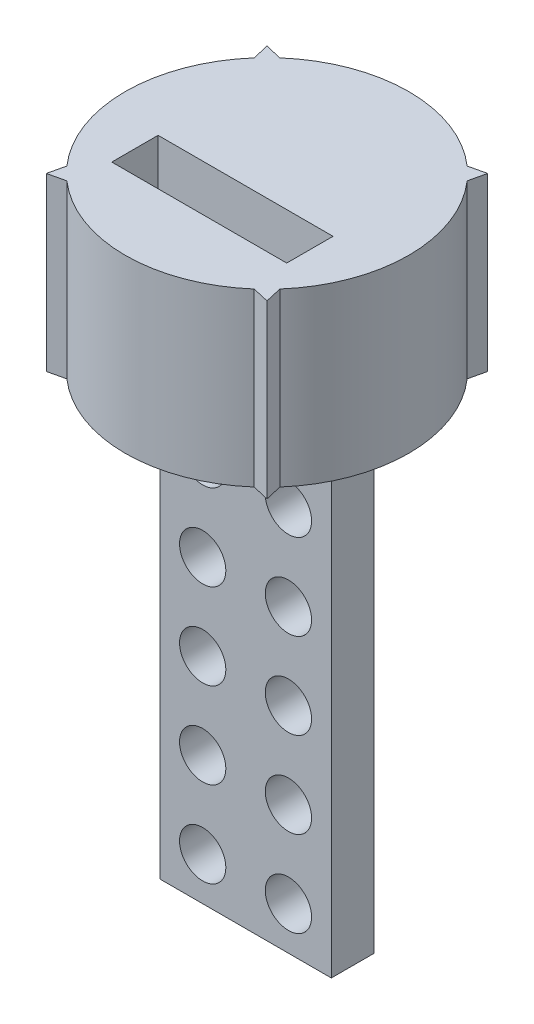
ISO-10303-21;
HEADER;
FILE_DESCRIPTION(('STEP AP214'),'2;1');
FILE_NAME('part.step','',(''),(''),'','','');
FILE_SCHEMA(('AUTOMOTIVE_DESIGN { 1 0 10303 214 1 1 1 1 }'));
ENDSEC;
DATA;
#1=APPLICATION_CONTEXT('core data for automotive mechanical design processes');
#2=APPLICATION_PROTOCOL_DEFINITION('international standard','automotive_design',2000,#1);
#3=PRODUCT_CONTEXT('',#1,'mechanical');
#4=PRODUCT('Part','Part','',(#3));
#5=PRODUCT_RELATED_PRODUCT_CATEGORY('part','',(#4));
#6=PRODUCT_DEFINITION_FORMATION('','',#4);
#7=PRODUCT_DEFINITION_CONTEXT('part definition',#1,'design');
#8=PRODUCT_DEFINITION('design','',#6,#7);
#9=PRODUCT_DEFINITION_SHAPE('','',#8);
#10=(LENGTH_UNIT() NAMED_UNIT(*) SI_UNIT(.MILLI.,.METRE.));
#11=(NAMED_UNIT(*) PLANE_ANGLE_UNIT() SI_UNIT($,.RADIAN.));
#12=(NAMED_UNIT(*) SI_UNIT($,.STERADIAN.) SOLID_ANGLE_UNIT());
#13=UNCERTAINTY_MEASURE_WITH_UNIT(LENGTH_MEASURE(1.E-05),#10,'distance_accuracy_value','');
#14=(GEOMETRIC_REPRESENTATION_CONTEXT(3) GLOBAL_UNCERTAINTY_ASSIGNED_CONTEXT((#13)) GLOBAL_UNIT_ASSIGNED_CONTEXT((#10,
#11,#12)) REPRESENTATION_CONTEXT('',''));
#15=CARTESIAN_POINT('',(0.,0.,0.));
#16=DIRECTION('',(0.,0.,1.));
#17=DIRECTION('',(1.,0.,0.));
#18=AXIS2_PLACEMENT_3D('',#15,#16,#17);
#19=CARTESIAN_POINT('',(0.,25.4,0.));
#20=DIRECTION('',(0.,-1.,0.));
#21=DIRECTION('',(0.,0.,-1.));
#22=AXIS2_PLACEMENT_3D('',#19,#20,#21);
#23=CYLINDRICAL_SURFACE('',#22,21.);
#24=CARTESIAN_POINT('',(0.,0.,0.));
#25=DIRECTION('',(0.,1.,0.));
#26=DIRECTION('',(0.,0.,1.));
#27=AXIS2_PLACEMENT_3D('',#24,#25,#26);
#28=CIRCLE('',#27,21.);
#29=CARTESIAN_POINT('',(13.8700852365894,0.,-15.767711803865));
#30=VERTEX_POINT('',#29);
#31=CARTESIAN_POINT('',(-13.8700852365893,0.,-15.7677118038652));
#32=VERTEX_POINT('',#31);
#33=EDGE_CURVE('E306',#30,#32,#28,.T.);
#34=ORIENTED_EDGE('',*,*,#33,.T.);
#35=DIRECTION('',(0.,-1.,0.));
#36=VECTOR('',#35,1.);
#37=CARTESIAN_POINT('',(-13.8700852365893,25.4,-15.7677118038652));
#38=LINE('',#37,#36);
#39=CARTESIAN_POINT('',(-13.8700852365893,25.4,-15.7677118038652));
#40=VERTEX_POINT('',#39);
#41=EDGE_CURVE('E389',#40,#32,#38,.T.);
#42=ORIENTED_EDGE('',*,*,#41,.F.);
#43=CARTESIAN_POINT('',(0.,25.4,0.));
#44=DIRECTION('',(0.,1.,0.));
#45=DIRECTION('',(0.,0.,1.));
#46=AXIS2_PLACEMENT_3D('',#43,#44,#45);
#47=CIRCLE('',#46,21.);
#48=CARTESIAN_POINT('',(13.8700852365894,25.4,-15.767711803865));
#49=VERTEX_POINT('',#48);
#50=EDGE_CURVE('E307',#49,#40,#47,.T.);
#51=ORIENTED_EDGE('',*,*,#50,.F.);
#52=DIRECTION('',(0.,-1.,0.));
#53=VECTOR('',#52,1.);
#54=CARTESIAN_POINT('',(13.8700852365894,25.4,-15.767711803865));
#55=LINE('',#54,#53);
#56=EDGE_CURVE('E333',#49,#30,#55,.T.);
#57=ORIENTED_EDGE('',*,*,#56,.T.);
#58=EDGE_LOOP('',(#34,#42,#51,#57));
#59=FACE_BOUND('',#58,.T.);
#60=ADVANCED_FACE('F35',(#59),#23,.T.);
#61=CARTESIAN_POINT('',(-16.3438750291584,25.4,-16.3438750291586));
#62=DIRECTION('',(-0.22683591546986,0.,0.973932989200464));
#63=DIRECTION('',(0.973932989200464,0.,0.22683591546986));
#64=AXIS2_PLACEMENT_3D('',#61,#62,#63);
#65=PLANE('',#64);
#66=DIRECTION('',(-0.973932989200464,0.,-0.22683591546986));
#67=VECTOR('',#66,1.);
#68=CARTESIAN_POINT('',(-16.3438750291584,0.,-16.3438750291586));
#69=LINE('',#68,#67);
#70=CARTESIAN_POINT('',(-16.3438750291584,0.,-16.3438750291586));
#71=VERTEX_POINT('',#70);
#72=EDGE_CURVE('E336',#32,#71,#69,.T.);
#73=ORIENTED_EDGE('',*,*,#72,.T.);
#74=DIRECTION('',(0.,-1.,0.));
#75=VECTOR('',#74,1.);
#76=CARTESIAN_POINT('',(-16.3438750291584,25.4,-16.3438750291586));
#77=LINE('',#76,#75);
#78=CARTESIAN_POINT('',(-16.3438750291584,25.4,-16.3438750291586));
#79=VERTEX_POINT('',#78);
#80=EDGE_CURVE('E386',#79,#71,#77,.T.);
#81=ORIENTED_EDGE('',*,*,#80,.F.);
#82=DIRECTION('',(-0.973932989200464,0.,-0.22683591546986));
#83=VECTOR('',#82,1.);
#84=CARTESIAN_POINT('',(-16.3438750291584,25.4,-16.3438750291586));
#85=LINE('',#84,#83);
#86=EDGE_CURVE('E310',#40,#79,#85,.T.);
#87=ORIENTED_EDGE('',*,*,#86,.F.);
#88=ORIENTED_EDGE('',*,*,#41,.T.);
#89=EDGE_LOOP('',(#73,#81,#87,#88));
#90=FACE_BOUND('',#89,.T.);
#91=ADVANCED_FACE('F445',(#90),#65,.F.);
#92=CARTESIAN_POINT('',(-15.767711803865,25.4,-13.8700852365894));
#93=DIRECTION('',(0.973932989200466,0.,-0.22683591546985));
#94=DIRECTION('',(-0.22683591546985,0.,-0.973932989200466));
#95=AXIS2_PLACEMENT_3D('',#92,#93,#94);
#96=PLANE('',#95);
#97=DIRECTION('',(0.22683591546985,0.,0.973932989200466));
#98=VECTOR('',#97,1.);
#99=CARTESIAN_POINT('',(-15.767711803865,0.,-13.8700852365894));
#100=LINE('',#99,#98);
#101=CARTESIAN_POINT('',(-15.767711803865,0.,-13.8700852365894));
#102=VERTEX_POINT('',#101);
#103=EDGE_CURVE('E338',#71,#102,#100,.T.);
#104=ORIENTED_EDGE('',*,*,#103,.T.);
#105=DIRECTION('',(0.,-1.,0.));
#106=VECTOR('',#105,1.);
#107=CARTESIAN_POINT('',(-15.767711803865,25.4,-13.8700852365894));
#108=LINE('',#107,#106);
#109=CARTESIAN_POINT('',(-15.767711803865,25.4,-13.8700852365894));
#110=VERTEX_POINT('',#109);
#111=EDGE_CURVE('E383',#110,#102,#108,.T.);
#112=ORIENTED_EDGE('',*,*,#111,.F.);
#113=DIRECTION('',(0.22683591546985,0.,0.973932989200466));
#114=VECTOR('',#113,1.);
#115=CARTESIAN_POINT('',(-15.767711803865,25.4,-13.8700852365894));
#116=LINE('',#115,#114);
#117=EDGE_CURVE('E313',#79,#110,#116,.T.);
#118=ORIENTED_EDGE('',*,*,#117,.F.);
#119=ORIENTED_EDGE('',*,*,#80,.T.);
#120=EDGE_LOOP('',(#104,#112,#118,#119));
#121=FACE_BOUND('',#120,.T.);
#122=ADVANCED_FACE('F450',(#121),#96,.F.);
#123=CARTESIAN_POINT('',(0.,25.4,0.));
#124=DIRECTION('',(0.,-1.,0.));
#125=DIRECTION('',(0.,0.,-1.));
#126=AXIS2_PLACEMENT_3D('',#123,#124,#125);
#127=CYLINDRICAL_SURFACE('',#126,21.);
#128=CARTESIAN_POINT('',(0.,0.,0.));
#129=DIRECTION('',(0.,1.,0.));
#130=DIRECTION('',(0.,0.,1.));
#131=AXIS2_PLACEMENT_3D('',#128,#129,#130);
#132=CIRCLE('',#131,21.);
#133=CARTESIAN_POINT('',(-15.7677118038652,0.,13.8700852365893));
#134=VERTEX_POINT('',#133);
#135=EDGE_CURVE('E340',#102,#134,#132,.T.);
#136=ORIENTED_EDGE('',*,*,#135,.T.);
#137=DIRECTION('',(0.,-1.,0.));
#138=VECTOR('',#137,1.);
#139=CARTESIAN_POINT('',(-15.7677118038652,25.4,13.8700852365893));
#140=LINE('',#139,#138);
#141=CARTESIAN_POINT('',(-15.7677118038652,25.4,13.8700852365893));
#142=VERTEX_POINT('',#141);
#143=EDGE_CURVE('E380',#142,#134,#140,.T.);
#144=ORIENTED_EDGE('',*,*,#143,.F.);
#145=CARTESIAN_POINT('',(0.,25.4,0.));
#146=DIRECTION('',(0.,1.,0.));
#147=DIRECTION('',(0.,0.,1.));
#148=AXIS2_PLACEMENT_3D('',#145,#146,#147);
#149=CIRCLE('',#148,21.);
#150=EDGE_CURVE('E315',#110,#142,#149,.T.);
#151=ORIENTED_EDGE('',*,*,#150,.F.);
#152=ORIENTED_EDGE('',*,*,#111,.T.);
#153=EDGE_LOOP('',(#136,#144,#151,#152));
#154=FACE_BOUND('',#153,.T.);
#155=ADVANCED_FACE('F456',(#154),#127,.T.);
#156=CARTESIAN_POINT('',(-16.3438750291586,25.4,16.3438750291584));
#157=DIRECTION('',(0.973932989200464,0.,0.226835915469858));
#158=DIRECTION('',(0.226835915469858,0.,-0.973932989200464));
#159=AXIS2_PLACEMENT_3D('',#156,#157,#158);
#160=PLANE('',#159);
#161=DIRECTION('',(-0.226835915469858,0.,0.973932989200464));
#162=VECTOR('',#161,1.);
#163=CARTESIAN_POINT('',(-16.3438750291586,0.,16.3438750291584));
#164=LINE('',#163,#162);
#165=CARTESIAN_POINT('',(-16.3438750291586,0.,16.3438750291584));
#166=VERTEX_POINT('',#165);
#167=EDGE_CURVE('E342',#134,#166,#164,.T.);
#168=ORIENTED_EDGE('',*,*,#167,.T.);
#169=DIRECTION('',(0.,-1.,0.));
#170=VECTOR('',#169,1.);
#171=CARTESIAN_POINT('',(-16.3438750291586,25.4,16.3438750291584));
#172=LINE('',#171,#170);
#173=CARTESIAN_POINT('',(-16.3438750291586,25.4,16.3438750291584));
#174=VERTEX_POINT('',#173);
#175=EDGE_CURVE('E377',#174,#166,#172,.T.);
#176=ORIENTED_EDGE('',*,*,#175,.F.);
#177=DIRECTION('',(-0.226835915469858,0.,0.973932989200464));
#178=VECTOR('',#177,1.);
#179=CARTESIAN_POINT('',(-16.3438750291586,25.4,16.3438750291584));
#180=LINE('',#179,#178);
#181=EDGE_CURVE('E317',#142,#174,#180,.T.);
#182=ORIENTED_EDGE('',*,*,#181,.F.);
#183=ORIENTED_EDGE('',*,*,#143,.T.);
#184=EDGE_LOOP('',(#168,#176,#182,#183));
#185=FACE_BOUND('',#184,.T.);
#186=ADVANCED_FACE('F460',(#185),#160,.F.);
#187=CARTESIAN_POINT('',(-13.8700852365894,25.4,15.767711803865));
#188=DIRECTION('',(-0.22683591546985,0.,-0.973932989200466));
#189=DIRECTION('',(-0.973932989200466,0.,0.22683591546985));
#190=AXIS2_PLACEMENT_3D('',#187,#188,#189);
#191=PLANE('',#190);
#192=DIRECTION('',(0.973932989200466,0.,-0.22683591546985));
#193=VECTOR('',#192,1.);
#194=CARTESIAN_POINT('',(-13.8700852365894,0.,15.767711803865));
#195=LINE('',#194,#193);
#196=CARTESIAN_POINT('',(-13.8700852365894,0.,15.767711803865));
#197=VERTEX_POINT('',#196);
#198=EDGE_CURVE('E344',#166,#197,#195,.T.);
#199=ORIENTED_EDGE('',*,*,#198,.T.);
#200=DIRECTION('',(0.,-1.,0.));
#201=VECTOR('',#200,1.);
#202=CARTESIAN_POINT('',(-13.8700852365894,25.4,15.767711803865));
#203=LINE('',#202,#201);
#204=CARTESIAN_POINT('',(-13.8700852365894,25.4,15.767711803865));
#205=VERTEX_POINT('',#204);
#206=EDGE_CURVE('E374',#205,#197,#203,.T.);
#207=ORIENTED_EDGE('',*,*,#206,.F.);
#208=DIRECTION('',(0.973932989200466,0.,-0.22683591546985));
#209=VECTOR('',#208,1.);
#210=CARTESIAN_POINT('',(-13.8700852365894,25.4,15.767711803865));
#211=LINE('',#210,#209);
#212=EDGE_CURVE('E319',#174,#205,#211,.T.);
#213=ORIENTED_EDGE('',*,*,#212,.F.);
#214=ORIENTED_EDGE('',*,*,#175,.T.);
#215=EDGE_LOOP('',(#199,#207,#213,#214));
#216=FACE_BOUND('',#215,.T.);
#217=ADVANCED_FACE('F464',(#216),#191,.F.);
#218=CARTESIAN_POINT('',(0.,25.4,0.));
#219=DIRECTION('',(0.,-1.,0.));
#220=DIRECTION('',(0.,0.,-1.));
#221=AXIS2_PLACEMENT_3D('',#218,#219,#220);
#222=CYLINDRICAL_SURFACE('',#221,21.);
#223=CARTESIAN_POINT('',(0.,0.,0.));
#224=DIRECTION('',(0.,1.,0.));
#225=DIRECTION('',(0.,0.,1.));
#226=AXIS2_PLACEMENT_3D('',#223,#224,#225);
#227=CIRCLE('',#226,21.);
#228=CARTESIAN_POINT('',(13.8700852365893,0.,15.7677118038652));
#229=VERTEX_POINT('',#228);
#230=EDGE_CURVE('E346',#197,#229,#227,.T.);
#231=ORIENTED_EDGE('',*,*,#230,.T.);
#232=DIRECTION('',(0.,-1.,0.));
#233=VECTOR('',#232,1.);
#234=CARTESIAN_POINT('',(13.8700852365893,25.4,15.7677118038652));
#235=LINE('',#234,#233);
#236=CARTESIAN_POINT('',(13.8700852365893,25.4,15.7677118038652));
#237=VERTEX_POINT('',#236);
#238=EDGE_CURVE('E371',#237,#229,#235,.T.);
#239=ORIENTED_EDGE('',*,*,#238,.F.);
#240=CARTESIAN_POINT('',(0.,25.4,0.));
#241=DIRECTION('',(0.,1.,0.));
#242=DIRECTION('',(0.,0.,1.));
#243=AXIS2_PLACEMENT_3D('',#240,#241,#242);
#244=CIRCLE('',#243,21.);
#245=EDGE_CURVE('E321',#205,#237,#244,.T.);
#246=ORIENTED_EDGE('',*,*,#245,.F.);
#247=ORIENTED_EDGE('',*,*,#206,.T.);
#248=EDGE_LOOP('',(#231,#239,#246,#247));
#249=FACE_BOUND('',#248,.T.);
#250=ADVANCED_FACE('F468',(#249),#222,.T.);
#251=CARTESIAN_POINT('',(16.3438750291584,25.4,16.3438750291586));
#252=DIRECTION('',(0.226835915469859,0.,-0.973932989200464));
#253=DIRECTION('',(-0.973932989200464,0.,-0.226835915469859));
#254=AXIS2_PLACEMENT_3D('',#251,#252,#253);
#255=PLANE('',#254);
#256=DIRECTION('',(0.973932989200464,0.,0.226835915469859));
#257=VECTOR('',#256,1.);
#258=CARTESIAN_POINT('',(16.3438750291584,0.,16.3438750291586));
#259=LINE('',#258,#257);
#260=CARTESIAN_POINT('',(16.3438750291584,0.,16.3438750291586));
#261=VERTEX_POINT('',#260);
#262=EDGE_CURVE('E348',#229,#261,#259,.T.);
#263=ORIENTED_EDGE('',*,*,#262,.T.);
#264=DIRECTION('',(0.,-1.,0.));
#265=VECTOR('',#264,1.);
#266=CARTESIAN_POINT('',(16.3438750291584,25.4,16.3438750291586));
#267=LINE('',#266,#265);
#268=CARTESIAN_POINT('',(16.3438750291584,25.4,16.3438750291586));
#269=VERTEX_POINT('',#268);
#270=EDGE_CURVE('E368',#269,#261,#267,.T.);
#271=ORIENTED_EDGE('',*,*,#270,.F.);
#272=DIRECTION('',(0.973932989200464,0.,0.226835915469859));
#273=VECTOR('',#272,1.);
#274=CARTESIAN_POINT('',(16.3438750291584,25.4,16.3438750291586));
#275=LINE('',#274,#273);
#276=EDGE_CURVE('E323',#237,#269,#275,.T.);
#277=ORIENTED_EDGE('',*,*,#276,.F.);
#278=ORIENTED_EDGE('',*,*,#238,.T.);
#279=EDGE_LOOP('',(#263,#271,#277,#278));
#280=FACE_BOUND('',#279,.T.);
#281=ADVANCED_FACE('F472',(#280),#255,.F.);
#282=CARTESIAN_POINT('',(15.767711803865,25.4,13.8700852365894));
#283=DIRECTION('',(-0.973932989200466,0.,0.226835915469849));
#284=DIRECTION('',(0.226835915469849,0.,0.973932989200466));
#285=AXIS2_PLACEMENT_3D('',#282,#283,#284);
#286=PLANE('',#285);
#287=DIRECTION('',(-0.226835915469849,0.,-0.973932989200466));
#288=VECTOR('',#287,1.);
#289=CARTESIAN_POINT('',(15.767711803865,0.,13.8700852365894));
#290=LINE('',#289,#288);
#291=CARTESIAN_POINT('',(15.767711803865,0.,13.8700852365894));
#292=VERTEX_POINT('',#291);
#293=EDGE_CURVE('E350',#261,#292,#290,.T.);
#294=ORIENTED_EDGE('',*,*,#293,.T.);
#295=DIRECTION('',(0.,-1.,0.));
#296=VECTOR('',#295,1.);
#297=CARTESIAN_POINT('',(15.767711803865,25.4,13.8700852365894));
#298=LINE('',#297,#296);
#299=CARTESIAN_POINT('',(15.767711803865,25.4,13.8700852365894));
#300=VERTEX_POINT('',#299);
#301=EDGE_CURVE('E365',#300,#292,#298,.T.);
#302=ORIENTED_EDGE('',*,*,#301,.F.);
#303=DIRECTION('',(-0.226835915469849,0.,-0.973932989200466));
#304=VECTOR('',#303,1.);
#305=CARTESIAN_POINT('',(15.767711803865,25.4,13.8700852365894));
#306=LINE('',#305,#304);
#307=EDGE_CURVE('E325',#269,#300,#306,.T.);
#308=ORIENTED_EDGE('',*,*,#307,.F.);
#309=ORIENTED_EDGE('',*,*,#270,.T.);
#310=EDGE_LOOP('',(#294,#302,#308,#309));
#311=FACE_BOUND('',#310,.T.);
#312=ADVANCED_FACE('F476',(#311),#286,.F.);
#313=CARTESIAN_POINT('',(0.,25.4,0.));
#314=DIRECTION('',(0.,-1.,0.));
#315=DIRECTION('',(0.,0.,-1.));
#316=AXIS2_PLACEMENT_3D('',#313,#314,#315);
#317=CYLINDRICAL_SURFACE('',#316,21.);
#318=CARTESIAN_POINT('',(0.,0.,0.));
#319=DIRECTION('',(0.,1.,0.));
#320=DIRECTION('',(0.,0.,1.));
#321=AXIS2_PLACEMENT_3D('',#318,#319,#320);
#322=CIRCLE('',#321,21.);
#323=CARTESIAN_POINT('',(15.7677118038652,0.,-13.8700852365893));
#324=VERTEX_POINT('',#323);
#325=EDGE_CURVE('E352',#292,#324,#322,.T.);
#326=ORIENTED_EDGE('',*,*,#325,.T.);
#327=DIRECTION('',(0.,-1.,0.));
#328=VECTOR('',#327,1.);
#329=CARTESIAN_POINT('',(15.7677118038652,25.4,-13.8700852365893));
#330=LINE('',#329,#328);
#331=CARTESIAN_POINT('',(15.7677118038652,25.4,-13.8700852365893));
#332=VERTEX_POINT('',#331);
#333=EDGE_CURVE('E362',#332,#324,#330,.T.);
#334=ORIENTED_EDGE('',*,*,#333,.F.);
#335=CARTESIAN_POINT('',(0.,25.4,0.));
#336=DIRECTION('',(0.,1.,0.));
#337=DIRECTION('',(0.,0.,1.));
#338=AXIS2_PLACEMENT_3D('',#335,#336,#337);
#339=CIRCLE('',#338,21.);
#340=EDGE_CURVE('E327',#300,#332,#339,.T.);
#341=ORIENTED_EDGE('',*,*,#340,.F.);
#342=ORIENTED_EDGE('',*,*,#301,.T.);
#343=EDGE_LOOP('',(#326,#334,#341,#342));
#344=FACE_BOUND('',#343,.T.);
#345=ADVANCED_FACE('F480',(#344),#317,.T.);
#346=CARTESIAN_POINT('',(16.3438750291586,25.4,-16.3438750291584));
#347=DIRECTION('',(-0.973932989200464,0.,-0.22683591546986));
#348=DIRECTION('',(-0.22683591546986,0.,0.973932989200464));
#349=AXIS2_PLACEMENT_3D('',#346,#347,#348);
#350=PLANE('',#349);
#351=DIRECTION('',(0.22683591546986,0.,-0.973932989200464));
#352=VECTOR('',#351,1.);
#353=CARTESIAN_POINT('',(16.3438750291586,0.,-16.3438750291584));
#354=LINE('',#353,#352);
#355=CARTESIAN_POINT('',(16.3438750291586,0.,-16.3438750291584));
#356=VERTEX_POINT('',#355);
#357=EDGE_CURVE('E354',#324,#356,#354,.T.);
#358=ORIENTED_EDGE('',*,*,#357,.T.);
#359=DIRECTION('',(0.,-1.,0.));
#360=VECTOR('',#359,1.);
#361=CARTESIAN_POINT('',(16.3438750291586,25.4,-16.3438750291584));
#362=LINE('',#361,#360);
#363=CARTESIAN_POINT('',(16.3438750291586,25.4,-16.3438750291584));
#364=VERTEX_POINT('',#363);
#365=EDGE_CURVE('E359',#364,#356,#362,.T.);
#366=ORIENTED_EDGE('',*,*,#365,.F.);
#367=DIRECTION('',(0.22683591546986,0.,-0.973932989200464));
#368=VECTOR('',#367,1.);
#369=CARTESIAN_POINT('',(16.3438750291586,25.4,-16.3438750291584));
#370=LINE('',#369,#368);
#371=EDGE_CURVE('E329',#332,#364,#370,.T.);
#372=ORIENTED_EDGE('',*,*,#371,.F.);
#373=ORIENTED_EDGE('',*,*,#333,.T.);
#374=EDGE_LOOP('',(#358,#366,#372,#373));
#375=FACE_BOUND('',#374,.T.);
#376=ADVANCED_FACE('F484',(#375),#350,.F.);
#377=CARTESIAN_POINT('',(13.8700852365894,25.4,-15.767711803865));
#378=DIRECTION('',(0.226835915469851,0.,0.973932989200466));
#379=DIRECTION('',(0.973932989200466,0.,-0.226835915469851));
#380=AXIS2_PLACEMENT_3D('',#377,#378,#379);
#381=PLANE('',#380);
#382=DIRECTION('',(-0.973932989200466,0.,0.226835915469851));
#383=VECTOR('',#382,1.);
#384=CARTESIAN_POINT('',(13.8700852365894,0.,-15.767711803865));
#385=LINE('',#384,#383);
#386=EDGE_CURVE('E311',#356,#30,#385,.T.);
#387=ORIENTED_EDGE('',*,*,#386,.T.);
#388=ORIENTED_EDGE('',*,*,#56,.F.);
#389=DIRECTION('',(-0.973932989200466,0.,0.226835915469851));
#390=VECTOR('',#389,1.);
#391=CARTESIAN_POINT('',(13.8700852365894,25.4,-15.767711803865));
#392=LINE('',#391,#390);
#393=EDGE_CURVE('E331',#364,#49,#392,.T.);
#394=ORIENTED_EDGE('',*,*,#393,.F.);
#395=ORIENTED_EDGE('',*,*,#365,.T.);
#396=EDGE_LOOP('',(#387,#388,#394,#395));
#397=FACE_BOUND('',#396,.T.);
#398=ADVANCED_FACE('F488',(#397),#381,.F.);
#399=CARTESIAN_POINT('',(0.,25.4,0.));
#400=DIRECTION('',(0.,1.,0.));
#401=DIRECTION('',(0.,0.,1.));
#402=AXIS2_PLACEMENT_3D('',#399,#400,#401);
#403=PLANE('',#402);
#404=DIRECTION('',(0.,0.,-1.));
#405=VECTOR('',#404,1.);
#406=CARTESIAN_POINT('',(-12.954,25.4,3.175));
#407=LINE('',#406,#405);
#408=CARTESIAN_POINT('',(-12.954,25.4,10.033));
#409=VERTEX_POINT('',#408);
#410=CARTESIAN_POINT('',(-12.954,25.4,3.175));
#411=VERTEX_POINT('',#410);
#412=EDGE_CURVE('E193',#409,#411,#407,.T.);
#413=ORIENTED_EDGE('',*,*,#412,.T.);
#414=DIRECTION('',(1.,0.,0.));
#415=VECTOR('',#414,1.);
#416=CARTESIAN_POINT('',(-12.954,25.4,3.175));
#417=LINE('',#416,#415);
#418=CARTESIAN_POINT('',(12.954,25.4,3.175));
#419=VERTEX_POINT('',#418);
#420=EDGE_CURVE('E201',#411,#419,#417,.T.);
#421=ORIENTED_EDGE('',*,*,#420,.T.);
#422=DIRECTION('',(0.,0.,1.));
#423=VECTOR('',#422,1.);
#424=CARTESIAN_POINT('',(12.954,25.4,3.175));
#425=LINE('',#424,#423);
#426=CARTESIAN_POINT('',(12.954,25.4,10.033));
#427=VERTEX_POINT('',#426);
#428=EDGE_CURVE('E207',#419,#427,#425,.T.);
#429=ORIENTED_EDGE('',*,*,#428,.T.);
#430=DIRECTION('',(-1.,0.,0.));
#431=VECTOR('',#430,1.);
#432=CARTESIAN_POINT('',(-12.954,25.4,10.033));
#433=LINE('',#432,#431);
#434=EDGE_CURVE('E198',#427,#409,#433,.T.);
#435=ORIENTED_EDGE('',*,*,#434,.T.);
#436=EDGE_LOOP('',(#413,#421,#429,#435));
#437=FACE_BOUND('',#436,.T.);
#438=ORIENTED_EDGE('',*,*,#50,.T.);
#439=ORIENTED_EDGE('',*,*,#86,.T.);
#440=ORIENTED_EDGE('',*,*,#117,.T.);
#441=ORIENTED_EDGE('',*,*,#150,.T.);
#442=ORIENTED_EDGE('',*,*,#181,.T.);
#443=ORIENTED_EDGE('',*,*,#212,.T.);
#444=ORIENTED_EDGE('',*,*,#245,.T.);
#445=ORIENTED_EDGE('',*,*,#276,.T.);
#446=ORIENTED_EDGE('',*,*,#307,.T.);
#447=ORIENTED_EDGE('',*,*,#340,.T.);
#448=ORIENTED_EDGE('',*,*,#371,.T.);
#449=ORIENTED_EDGE('',*,*,#393,.T.);
#450=EDGE_LOOP('',(#438,#439,#440,#441,#442,#443,#444,#445,#446,#447,#448,#449));
#451=FACE_BOUND('',#450,.T.);
#452=ADVANCED_FACE('F209',(#437,#451),#403,.T.);
#453=CARTESIAN_POINT('',(0.,0.,0.));
#454=DIRECTION('',(0.,1.,0.));
#455=DIRECTION('',(0.,0.,1.));
#456=AXIS2_PLACEMENT_3D('',#453,#454,#455);
#457=PLANE('',#456);
#458=DIRECTION('',(0.,0.,-1.));
#459=VECTOR('',#458,1.);
#460=CARTESIAN_POINT('',(-17.78,0.,3.175));
#461=LINE('',#460,#459);
#462=CARTESIAN_POINT('',(-17.78,0.,-8.255));
#463=VERTEX_POINT('',#462);
#464=CARTESIAN_POINT('',(-17.78,0.,3.175));
#465=VERTEX_POINT('',#464);
#466=EDGE_CURVE('E399',#463,#465,#461,.F.);
#467=ORIENTED_EDGE('',*,*,#466,.T.);
#468=DIRECTION('',(1.,0.,0.));
#469=VECTOR('',#468,1.);
#470=CARTESIAN_POINT('',(0.,0.,3.175));
#471=LINE('',#470,#469);
#472=CARTESIAN_POINT('',(-12.954,0.,3.175));
#473=VERTEX_POINT('',#472);
#474=EDGE_CURVE('E403',#465,#473,#471,.T.);
#475=ORIENTED_EDGE('',*,*,#474,.T.);
#476=DIRECTION('',(0.,0.,-1.));
#477=VECTOR('',#476,1.);
#478=CARTESIAN_POINT('',(-12.954,0.,3.175));
#479=LINE('',#478,#477);
#480=CARTESIAN_POINT('',(-12.954,0.,10.033));
#481=VERTEX_POINT('',#480);
#482=EDGE_CURVE('E196',#481,#473,#479,.T.);
#483=ORIENTED_EDGE('',*,*,#482,.F.);
#484=DIRECTION('',(-1.,0.,0.));
#485=VECTOR('',#484,1.);
#486=CARTESIAN_POINT('',(-12.954,0.,10.033));
#487=LINE('',#486,#485);
#488=CARTESIAN_POINT('',(12.954,0.,10.033));
#489=VERTEX_POINT('',#488);
#490=EDGE_CURVE('E212',#489,#481,#487,.T.);
#491=ORIENTED_EDGE('',*,*,#490,.F.);
#492=DIRECTION('',(0.,0.,1.));
#493=VECTOR('',#492,1.);
#494=CARTESIAN_POINT('',(12.954,0.,3.175));
#495=LINE('',#494,#493);
#496=CARTESIAN_POINT('',(12.954,0.,3.175));
#497=VERTEX_POINT('',#496);
#498=EDGE_CURVE('E215',#497,#489,#495,.T.);
#499=ORIENTED_EDGE('',*,*,#498,.F.);
#500=DIRECTION('',(1.,0.,0.));
#501=VECTOR('',#500,1.);
#502=CARTESIAN_POINT('',(0.,0.,3.175));
#503=LINE('',#502,#501);
#504=CARTESIAN_POINT('',(17.78,0.,3.175));
#505=VERTEX_POINT('',#504);
#506=EDGE_CURVE('E51',#497,#505,#503,.T.);
#507=ORIENTED_EDGE('',*,*,#506,.T.);
#508=DIRECTION('',(0.,0.,-1.));
#509=VECTOR('',#508,1.);
#510=CARTESIAN_POINT('',(17.78,0.,0.));
#511=LINE('',#510,#509);
#512=CARTESIAN_POINT('',(17.78,0.,-8.255));
#513=VERTEX_POINT('',#512);
#514=EDGE_CURVE('E397',#505,#513,#511,.T.);
#515=ORIENTED_EDGE('',*,*,#514,.T.);
#516=DIRECTION('',(-1.,0.,0.));
#517=VECTOR('',#516,1.);
#518=CARTESIAN_POINT('',(-12.7,0.,-8.255));
#519=LINE('',#518,#517);
#520=EDGE_CURVE('E395',#513,#463,#519,.T.);
#521=ORIENTED_EDGE('',*,*,#520,.T.);
#522=EDGE_LOOP('',(#467,#475,#483,#491,#499,#507,#515,#521));
#523=FACE_BOUND('',#522,.T.);
#524=ORIENTED_EDGE('',*,*,#33,.F.);
#525=ORIENTED_EDGE('',*,*,#386,.F.);
#526=ORIENTED_EDGE('',*,*,#357,.F.);
#527=ORIENTED_EDGE('',*,*,#325,.F.);
#528=ORIENTED_EDGE('',*,*,#293,.F.);
#529=ORIENTED_EDGE('',*,*,#262,.F.);
#530=ORIENTED_EDGE('',*,*,#230,.F.);
#531=ORIENTED_EDGE('',*,*,#198,.F.);
#532=ORIENTED_EDGE('',*,*,#167,.F.);
#533=ORIENTED_EDGE('',*,*,#135,.F.);
#534=ORIENTED_EDGE('',*,*,#103,.F.);
#535=ORIENTED_EDGE('',*,*,#72,.F.);
#536=EDGE_LOOP('',(#524,#525,#526,#527,#528,#529,#530,#531,#532,#533,#534,#535));
#537=FACE_BOUND('',#536,.T.);
#538=ADVANCED_FACE('F423',(#523,#537),#457,.F.);
#539=CARTESIAN_POINT('',(0.,0.,3.175));
#540=DIRECTION('',(0.,0.,1.));
#541=DIRECTION('',(1.,0.,0.));
#542=AXIS2_PLACEMENT_3D('',#539,#540,#541);
#543=PLANE('',#542);
#544=CARTESIAN_POINT('',(-6.34999999999961,-50.8,3.175));
#545=DIRECTION('',(0.,0.,1.));
#546=DIRECTION('',(1.,0.,0.));
#547=AXIS2_PLACEMENT_3D('',#544,#545,#546);
#548=CIRCLE('',#547,3.429);
#549=CARTESIAN_POINT('',(-2.92099999999961,-50.8,3.175));
#550=VERTEX_POINT('',#549);
#551=EDGE_CURVE('E235',#550,#550,#548,.T.);
#552=ORIENTED_EDGE('',*,*,#551,.F.);
#553=EDGE_LOOP('',(#552));
#554=FACE_BOUND('',#553,.T.);
#555=CARTESIAN_POINT('',(-6.34999999999987,-25.4,3.175));
#556=DIRECTION('',(0.,0.,1.));
#557=DIRECTION('',(1.,0.,0.));
#558=AXIS2_PLACEMENT_3D('',#555,#556,#557);
#559=CIRCLE('',#558,3.429);
#560=CARTESIAN_POINT('',(-2.92099999999988,-25.4,3.175));
#561=VERTEX_POINT('',#560);
#562=EDGE_CURVE('E247',#561,#561,#559,.T.);
#563=ORIENTED_EDGE('',*,*,#562,.F.);
#564=EDGE_LOOP('',(#563));
#565=FACE_BOUND('',#564,.T.);
#566=CARTESIAN_POINT('',(6.35000000000039,-50.8,3.175));
#567=DIRECTION('',(0.,0.,1.));
#568=DIRECTION('',(1.,0.,0.));
#569=AXIS2_PLACEMENT_3D('',#566,#567,#568);
#570=CIRCLE('',#569,3.429);
#571=CARTESIAN_POINT('',(9.77900000000039,-50.8,3.175));
#572=VERTEX_POINT('',#571);
#573=EDGE_CURVE('E259',#572,#572,#570,.T.);
#574=ORIENTED_EDGE('',*,*,#573,.F.);
#575=EDGE_LOOP('',(#574));
#576=FACE_BOUND('',#575,.T.);
#577=CARTESIAN_POINT('',(6.35000000000012,-25.4,3.175));
#578=DIRECTION('',(0.,0.,1.));
#579=DIRECTION('',(1.,0.,0.));
#580=AXIS2_PLACEMENT_3D('',#577,#578,#579);
#581=CIRCLE('',#580,3.429);
#582=CARTESIAN_POINT('',(9.77900000000012,-25.4,3.175));
#583=VERTEX_POINT('',#582);
#584=EDGE_CURVE('E271',#583,#583,#581,.T.);
#585=ORIENTED_EDGE('',*,*,#584,.F.);
#586=EDGE_LOOP('',(#585));
#587=FACE_BOUND('',#586,.T.);
#588=CARTESIAN_POINT('',(-6.35000000000001,-12.7,3.175));
#589=DIRECTION('',(0.,0.,1.));
#590=DIRECTION('',(1.,0.,0.));
#591=AXIS2_PLACEMENT_3D('',#588,#589,#590);
#592=CIRCLE('',#591,3.429);
#593=CARTESIAN_POINT('',(-2.92100000000001,-12.7,3.175));
#594=VERTEX_POINT('',#593);
#595=EDGE_CURVE('E283',#594,#594,#592,.T.);
#596=ORIENTED_EDGE('',*,*,#595,.F.);
#597=EDGE_LOOP('',(#596));
#598=FACE_BOUND('',#597,.T.);
#599=DIRECTION('',(0.,-1.,0.));
#600=VECTOR('',#599,1.);
#601=CARTESIAN_POINT('',(-12.954,25.4,3.175));
#602=LINE('',#601,#600);
#603=EDGE_CURVE('E189',#411,#473,#602,.T.);
#604=ORIENTED_EDGE('',*,*,#603,.T.);
#605=ORIENTED_EDGE('',*,*,#474,.F.);
#606=CARTESIAN_POINT('',(-17.78,-5.08,3.175));
#607=DIRECTION('',(0.,0.,1.));
#608=DIRECTION('',(1.,0.,0.));
#609=AXIS2_PLACEMENT_3D('',#606,#607,#608);
#610=CIRCLE('',#609,5.08);
#611=CARTESIAN_POINT('',(-12.7,-5.08,3.175));
#612=VERTEX_POINT('',#611);
#613=EDGE_CURVE('E44',#465,#612,#610,.F.);
#614=ORIENTED_EDGE('',*,*,#613,.T.);
#615=DIRECTION('',(0.,-1.,0.));
#616=VECTOR('',#615,1.);
#617=CARTESIAN_POINT('',(-12.7,0.,3.175));
#618=LINE('',#617,#616);
#619=CARTESIAN_POINT('',(-12.7,-69.85,3.175));
#620=VERTEX_POINT('',#619);
#621=EDGE_CURVE('E289',#612,#620,#618,.T.);
#622=ORIENTED_EDGE('',*,*,#621,.T.);
#623=DIRECTION('',(1.,0.,0.));
#624=VECTOR('',#623,1.);
#625=CARTESIAN_POINT('',(-12.7,-69.85,3.175));
#626=LINE('',#625,#624);
#627=CARTESIAN_POINT('',(12.7,-69.85,3.175));
#628=VERTEX_POINT('',#627);
#629=EDGE_CURVE('E291',#620,#628,#626,.T.);
#630=ORIENTED_EDGE('',*,*,#629,.T.);
#631=DIRECTION('',(0.,1.,0.));
#632=VECTOR('',#631,1.);
#633=CARTESIAN_POINT('',(12.7,0.,3.175));
#634=LINE('',#633,#632);
#635=CARTESIAN_POINT('',(12.7,-5.08,3.175));
#636=VERTEX_POINT('',#635);
#637=EDGE_CURVE('E294',#628,#636,#634,.T.);
#638=ORIENTED_EDGE('',*,*,#637,.T.);
#639=CARTESIAN_POINT('',(17.78,-5.08,3.175));
#640=DIRECTION('',(0.,0.,1.));
#641=DIRECTION('',(1.,0.,0.));
#642=AXIS2_PLACEMENT_3D('',#639,#640,#641);
#643=CIRCLE('',#642,5.08);
#644=EDGE_CURVE('E11',#636,#505,#643,.F.);
#645=ORIENTED_EDGE('',*,*,#644,.T.);
#646=ORIENTED_EDGE('',*,*,#506,.F.);
#647=DIRECTION('',(0.,-1.,0.));
#648=VECTOR('',#647,1.);
#649=CARTESIAN_POINT('',(12.954,25.4,3.175));
#650=LINE('',#649,#648);
#651=EDGE_CURVE('E197',#419,#497,#650,.T.);
#652=ORIENTED_EDGE('',*,*,#651,.F.);
#653=ORIENTED_EDGE('',*,*,#420,.F.);
#654=EDGE_LOOP('',(#604,#605,#614,#622,#630,#638,#645,#646,#652,#653));
#655=FACE_BOUND('',#654,.T.);
#656=CARTESIAN_POINT('',(6.34999999999999,-12.7,3.175));
#657=DIRECTION('',(0.,0.,1.));
#658=DIRECTION('',(1.,0.,0.));
#659=AXIS2_PLACEMENT_3D('',#656,#657,#658);
#660=CIRCLE('',#659,3.429);
#661=CARTESIAN_POINT('',(9.77899999999999,-12.7,3.175));
#662=VERTEX_POINT('',#661);
#663=EDGE_CURVE('E277',#662,#662,#660,.T.);
#664=ORIENTED_EDGE('',*,*,#663,.F.);
#665=EDGE_LOOP('',(#664));
#666=FACE_BOUND('',#665,.T.);
#667=CARTESIAN_POINT('',(6.35000000000026,-38.1,3.175));
#668=DIRECTION('',(0.,0.,1.));
#669=DIRECTION('',(1.,0.,0.));
#670=AXIS2_PLACEMENT_3D('',#667,#668,#669);
#671=CIRCLE('',#670,3.429);
#672=CARTESIAN_POINT('',(9.77900000000025,-38.1,3.175));
#673=VERTEX_POINT('',#672);
#674=EDGE_CURVE('E265',#673,#673,#671,.T.);
#675=ORIENTED_EDGE('',*,*,#674,.F.);
#676=EDGE_LOOP('',(#675));
#677=FACE_BOUND('',#676,.T.);
#678=CARTESIAN_POINT('',(6.35000000000052,-63.5,3.175));
#679=DIRECTION('',(0.,0.,1.));
#680=DIRECTION('',(1.,0.,0.));
#681=AXIS2_PLACEMENT_3D('',#678,#679,#680);
#682=CIRCLE('',#681,3.429);
#683=CARTESIAN_POINT('',(9.77900000000052,-63.5,3.175));
#684=VERTEX_POINT('',#683);
#685=EDGE_CURVE('E253',#684,#684,#682,.T.);
#686=ORIENTED_EDGE('',*,*,#685,.F.);
#687=EDGE_LOOP('',(#686));
#688=FACE_BOUND('',#687,.T.);
#689=CARTESIAN_POINT('',(-6.34999999999974,-38.1,3.175));
#690=DIRECTION('',(0.,0.,1.));
#691=DIRECTION('',(1.,0.,0.));
#692=AXIS2_PLACEMENT_3D('',#689,#690,#691);
#693=CIRCLE('',#692,3.429);
#694=CARTESIAN_POINT('',(-2.92099999999974,-38.1,3.175));
#695=VERTEX_POINT('',#694);
#696=EDGE_CURVE('E241',#695,#695,#693,.T.);
#697=ORIENTED_EDGE('',*,*,#696,.F.);
#698=EDGE_LOOP('',(#697));
#699=FACE_BOUND('',#698,.T.);
#700=CARTESIAN_POINT('',(-6.34999999999947,-63.5,3.175));
#701=DIRECTION('',(0.,0.,1.));
#702=DIRECTION('',(1.,0.,0.));
#703=AXIS2_PLACEMENT_3D('',#700,#701,#702);
#704=CIRCLE('',#703,3.429);
#705=CARTESIAN_POINT('',(-2.92099999999948,-63.5,3.175));
#706=VERTEX_POINT('',#705);
#707=EDGE_CURVE('E229',#706,#706,#704,.T.);
#708=ORIENTED_EDGE('',*,*,#707,.F.);
#709=EDGE_LOOP('',(#708));
#710=FACE_BOUND('',#709,.T.);
#711=ADVANCED_FACE('F202',(#554,#565,#576,#587,#598,#655,#666,#677,#688,#699,#710),#543,.T.);
#712=CARTESIAN_POINT('',(0.,0.,-3.175));
#713=DIRECTION('',(0.,0.,1.));
#714=DIRECTION('',(1.,0.,0.));
#715=AXIS2_PLACEMENT_3D('',#712,#713,#714);
#716=PLANE('',#715);
#717=DIRECTION('',(0.,-1.,0.));
#718=VECTOR('',#717,1.);
#719=CARTESIAN_POINT('',(-12.7,0.,-3.175));
#720=LINE('',#719,#718);
#721=CARTESIAN_POINT('',(-12.7,-5.08,-3.175));
#722=VERTEX_POINT('',#721);
#723=CARTESIAN_POINT('',(-12.7,-69.85,-3.175));
#724=VERTEX_POINT('',#723);
#725=EDGE_CURVE('E286',#722,#724,#720,.T.);
#726=ORIENTED_EDGE('',*,*,#725,.F.);
#727=DIRECTION('',(-1.,0.,0.));
#728=VECTOR('',#727,1.);
#729=CARTESIAN_POINT('',(12.7,-5.08,-3.175));
#730=LINE('',#729,#728);
#731=CARTESIAN_POINT('',(12.7,-5.08,-3.175));
#732=VERTEX_POINT('',#731);
#733=EDGE_CURVE('E406',#722,#732,#730,.F.);
#734=ORIENTED_EDGE('',*,*,#733,.T.);
#735=DIRECTION('',(0.,1.,0.));
#736=VECTOR('',#735,1.);
#737=CARTESIAN_POINT('',(12.7,0.,-3.175));
#738=LINE('',#737,#736);
#739=CARTESIAN_POINT('',(12.7,-69.85,-3.175));
#740=VERTEX_POINT('',#739);
#741=EDGE_CURVE('E292',#740,#732,#738,.T.);
#742=ORIENTED_EDGE('',*,*,#741,.F.);
#743=DIRECTION('',(1.,0.,0.));
#744=VECTOR('',#743,1.);
#745=CARTESIAN_POINT('',(-12.7,-69.85,-3.175));
#746=LINE('',#745,#744);
#747=EDGE_CURVE('E298',#724,#740,#746,.T.);
#748=ORIENTED_EDGE('',*,*,#747,.F.);
#749=EDGE_LOOP('',(#726,#734,#742,#748));
#750=FACE_BOUND('',#749,.T.);
#751=CARTESIAN_POINT('',(-6.35000000000001,-12.7,-3.175));
#752=DIRECTION('',(0.,0.,1.));
#753=DIRECTION('',(1.,0.,0.));
#754=AXIS2_PLACEMENT_3D('',#751,#752,#753);
#755=CIRCLE('',#754,3.429);
#756=CARTESIAN_POINT('',(-2.92100000000001,-12.7,-3.175));
#757=VERTEX_POINT('',#756);
#758=EDGE_CURVE('E280',#757,#757,#755,.T.);
#759=ORIENTED_EDGE('',*,*,#758,.T.);
#760=EDGE_LOOP('',(#759));
#761=FACE_BOUND('',#760,.T.);
#762=CARTESIAN_POINT('',(6.34999999999999,-12.7,-3.175));
#763=DIRECTION('',(0.,0.,1.));
#764=DIRECTION('',(1.,0.,0.));
#765=AXIS2_PLACEMENT_3D('',#762,#763,#764);
#766=CIRCLE('',#765,3.429);
#767=CARTESIAN_POINT('',(9.77899999999999,-12.7,-3.175));
#768=VERTEX_POINT('',#767);
#769=EDGE_CURVE('E274',#768,#768,#766,.T.);
#770=ORIENTED_EDGE('',*,*,#769,.T.);
#771=EDGE_LOOP('',(#770));
#772=FACE_BOUND('',#771,.T.);
#773=CARTESIAN_POINT('',(6.35000000000012,-25.4,-3.175));
#774=DIRECTION('',(0.,0.,1.));
#775=DIRECTION('',(1.,0.,0.));
#776=AXIS2_PLACEMENT_3D('',#773,#774,#775);
#777=CIRCLE('',#776,3.429);
#778=CARTESIAN_POINT('',(9.77900000000012,-25.4,-3.175));
#779=VERTEX_POINT('',#778);
#780=EDGE_CURVE('E268',#779,#779,#777,.T.);
#781=ORIENTED_EDGE('',*,*,#780,.T.);
#782=EDGE_LOOP('',(#781));
#783=FACE_BOUND('',#782,.T.);
#784=CARTESIAN_POINT('',(6.35000000000026,-38.1,-3.175));
#785=DIRECTION('',(0.,0.,1.));
#786=DIRECTION('',(1.,0.,0.));
#787=AXIS2_PLACEMENT_3D('',#784,#785,#786);
#788=CIRCLE('',#787,3.429);
#789=CARTESIAN_POINT('',(9.77900000000025,-38.1,-3.175));
#790=VERTEX_POINT('',#789);
#791=EDGE_CURVE('E262',#790,#790,#788,.T.);
#792=ORIENTED_EDGE('',*,*,#791,.T.);
#793=EDGE_LOOP('',(#792));
#794=FACE_BOUND('',#793,.T.);
#795=CARTESIAN_POINT('',(6.35000000000039,-50.8,-3.175));
#796=DIRECTION('',(0.,0.,1.));
#797=DIRECTION('',(1.,0.,0.));
#798=AXIS2_PLACEMENT_3D('',#795,#796,#797);
#799=CIRCLE('',#798,3.429);
#800=CARTESIAN_POINT('',(9.77900000000039,-50.8,-3.175));
#801=VERTEX_POINT('',#800);
#802=EDGE_CURVE('E256',#801,#801,#799,.T.);
#803=ORIENTED_EDGE('',*,*,#802,.T.);
#804=EDGE_LOOP('',(#803));
#805=FACE_BOUND('',#804,.T.);
#806=CARTESIAN_POINT('',(6.35000000000052,-63.5,-3.175));
#807=DIRECTION('',(0.,0.,1.));
#808=DIRECTION('',(1.,0.,0.));
#809=AXIS2_PLACEMENT_3D('',#806,#807,#808);
#810=CIRCLE('',#809,3.429);
#811=CARTESIAN_POINT('',(9.77900000000052,-63.5,-3.175));
#812=VERTEX_POINT('',#811);
#813=EDGE_CURVE('E250',#812,#812,#810,.T.);
#814=ORIENTED_EDGE('',*,*,#813,.T.);
#815=EDGE_LOOP('',(#814));
#816=FACE_BOUND('',#815,.T.);
#817=CARTESIAN_POINT('',(-6.34999999999987,-25.4,-3.175));
#818=DIRECTION('',(0.,0.,1.));
#819=DIRECTION('',(1.,0.,0.));
#820=AXIS2_PLACEMENT_3D('',#817,#818,#819);
#821=CIRCLE('',#820,3.429);
#822=CARTESIAN_POINT('',(-2.92099999999988,-25.4,-3.175));
#823=VERTEX_POINT('',#822);
#824=EDGE_CURVE('E244',#823,#823,#821,.T.);
#825=ORIENTED_EDGE('',*,*,#824,.T.);
#826=EDGE_LOOP('',(#825));
#827=FACE_BOUND('',#826,.T.);
#828=CARTESIAN_POINT('',(-6.34999999999974,-38.1,-3.175));
#829=DIRECTION('',(0.,0.,1.));
#830=DIRECTION('',(1.,0.,0.));
#831=AXIS2_PLACEMENT_3D('',#828,#829,#830);
#832=CIRCLE('',#831,3.429);
#833=CARTESIAN_POINT('',(-2.92099999999974,-38.1,-3.175));
#834=VERTEX_POINT('',#833);
#835=EDGE_CURVE('E238',#834,#834,#832,.T.);
#836=ORIENTED_EDGE('',*,*,#835,.T.);
#837=EDGE_LOOP('',(#836));
#838=FACE_BOUND('',#837,.T.);
#839=CARTESIAN_POINT('',(-6.34999999999961,-50.8,-3.175));
#840=DIRECTION('',(0.,0.,1.));
#841=DIRECTION('',(1.,0.,0.));
#842=AXIS2_PLACEMENT_3D('',#839,#840,#841);
#843=CIRCLE('',#842,3.429);
#844=CARTESIAN_POINT('',(-2.92099999999961,-50.8,-3.175));
#845=VERTEX_POINT('',#844);
#846=EDGE_CURVE('E232',#845,#845,#843,.T.);
#847=ORIENTED_EDGE('',*,*,#846,.T.);
#848=EDGE_LOOP('',(#847));
#849=FACE_BOUND('',#848,.T.);
#850=CARTESIAN_POINT('',(-6.34999999999947,-63.5,-3.175));
#851=DIRECTION('',(0.,0.,1.));
#852=DIRECTION('',(1.,0.,0.));
#853=AXIS2_PLACEMENT_3D('',#850,#851,#852);
#854=CIRCLE('',#853,3.429);
#855=CARTESIAN_POINT('',(-2.92099999999948,-63.5,-3.175));
#856=VERTEX_POINT('',#855);
#857=EDGE_CURVE('E225',#856,#856,#854,.T.);
#858=ORIENTED_EDGE('',*,*,#857,.T.);
#859=EDGE_LOOP('',(#858));
#860=FACE_BOUND('',#859,.T.);
#861=ADVANCED_FACE('F500',(#750,#761,#772,#783,#794,#805,#816,#827,#838,#849,#860),#716,.F.);
#862=CARTESIAN_POINT('',(-12.7,0.,3.175));
#863=DIRECTION('',(1.,0.,0.));
#864=DIRECTION('',(0.,1.,0.));
#865=AXIS2_PLACEMENT_3D('',#862,#863,#864);
#866=PLANE('',#865);
#867=ORIENTED_EDGE('',*,*,#621,.F.);
#868=DIRECTION('',(0.,0.,-1.));
#869=VECTOR('',#868,1.);
#870=CARTESIAN_POINT('',(-12.7,-5.08,3.175));
#871=LINE('',#870,#869);
#872=EDGE_CURVE('E392',#612,#722,#871,.T.);
#873=ORIENTED_EDGE('',*,*,#872,.T.);
#874=ORIENTED_EDGE('',*,*,#725,.T.);
#875=DIRECTION('',(0.,0.,-1.));
#876=VECTOR('',#875,1.);
#877=CARTESIAN_POINT('',(-12.7,-69.85,3.175));
#878=LINE('',#877,#876);
#879=EDGE_CURVE('E303',#620,#724,#878,.T.);
#880=ORIENTED_EDGE('',*,*,#879,.F.);
#881=EDGE_LOOP('',(#867,#873,#874,#880));
#882=FACE_BOUND('',#881,.T.);
#883=ADVANCED_FACE('F435',(#882),#866,.F.);
#884=CARTESIAN_POINT('',(-12.7,-69.85,3.175));
#885=DIRECTION('',(0.,1.,0.));
#886=DIRECTION('',(0.,0.,1.));
#887=AXIS2_PLACEMENT_3D('',#884,#885,#886);
#888=PLANE('',#887);
#889=ORIENTED_EDGE('',*,*,#747,.T.);
#890=DIRECTION('',(0.,0.,-1.));
#891=VECTOR('',#890,1.);
#892=CARTESIAN_POINT('',(12.7,-69.85,3.175));
#893=LINE('',#892,#891);
#894=EDGE_CURVE('E296',#628,#740,#893,.T.);
#895=ORIENTED_EDGE('',*,*,#894,.F.);
#896=ORIENTED_EDGE('',*,*,#629,.F.);
#897=ORIENTED_EDGE('',*,*,#879,.T.);
#898=EDGE_LOOP('',(#889,#895,#896,#897));
#899=FACE_BOUND('',#898,.T.);
#900=ADVANCED_FACE('F499',(#899),#888,.F.);
#901=CARTESIAN_POINT('',(12.7,0.,3.175));
#902=DIRECTION('',(-1.,0.,0.));
#903=DIRECTION('',(0.,-1.,0.));
#904=AXIS2_PLACEMENT_3D('',#901,#902,#903);
#905=PLANE('',#904);
#906=ORIENTED_EDGE('',*,*,#741,.T.);
#907=DIRECTION('',(0.,0.,-1.));
#908=VECTOR('',#907,1.);
#909=CARTESIAN_POINT('',(12.7,-5.08,0.));
#910=LINE('',#909,#908);
#911=EDGE_CURVE('E59',#732,#636,#910,.F.);
#912=ORIENTED_EDGE('',*,*,#911,.T.);
#913=ORIENTED_EDGE('',*,*,#637,.F.);
#914=ORIENTED_EDGE('',*,*,#894,.T.);
#915=EDGE_LOOP('',(#906,#912,#913,#914));
#916=FACE_BOUND('',#915,.T.);
#917=ADVANCED_FACE('F503',(#916),#905,.F.);
#918=CARTESIAN_POINT('',(-6.35000000000001,-12.7,3.175));
#919=DIRECTION('',(0.,0.,-1.));
#920=DIRECTION('',(-1.,0.,0.));
#921=AXIS2_PLACEMENT_3D('',#918,#919,#920);
#922=CYLINDRICAL_SURFACE('',#921,3.429);
#923=ORIENTED_EDGE('',*,*,#595,.T.);
#924=EDGE_LOOP('',(#923));
#925=FACE_BOUND('',#924,.T.);
#926=ORIENTED_EDGE('',*,*,#758,.F.);
#927=EDGE_LOOP('',(#926));
#928=FACE_BOUND('',#927,.T.);
#929=ADVANCED_FACE('F507',(#925,#928),#922,.F.);
#930=CARTESIAN_POINT('',(6.34999999999999,-12.7,3.175));
#931=DIRECTION('',(0.,0.,-1.));
#932=DIRECTION('',(-1.,0.,0.));
#933=AXIS2_PLACEMENT_3D('',#930,#931,#932);
#934=CYLINDRICAL_SURFACE('',#933,3.429);
#935=ORIENTED_EDGE('',*,*,#663,.T.);
#936=EDGE_LOOP('',(#935));
#937=FACE_BOUND('',#936,.T.);
#938=ORIENTED_EDGE('',*,*,#769,.F.);
#939=EDGE_LOOP('',(#938));
#940=FACE_BOUND('',#939,.T.);
#941=ADVANCED_FACE('F516',(#937,#940),#934,.F.);
#942=CARTESIAN_POINT('',(6.35000000000012,-25.4,3.175));
#943=DIRECTION('',(0.,0.,-1.));
#944=DIRECTION('',(-1.,0.,0.));
#945=AXIS2_PLACEMENT_3D('',#942,#943,#944);
#946=CYLINDRICAL_SURFACE('',#945,3.429);
#947=ORIENTED_EDGE('',*,*,#584,.T.);
#948=EDGE_LOOP('',(#947));
#949=FACE_BOUND('',#948,.T.);
#950=ORIENTED_EDGE('',*,*,#780,.F.);
#951=EDGE_LOOP('',(#950));
#952=FACE_BOUND('',#951,.T.);
#953=ADVANCED_FACE('F520',(#949,#952),#946,.F.);
#954=CARTESIAN_POINT('',(6.35000000000026,-38.1,3.175));
#955=DIRECTION('',(0.,0.,-1.));
#956=DIRECTION('',(-1.,0.,0.));
#957=AXIS2_PLACEMENT_3D('',#954,#955,#956);
#958=CYLINDRICAL_SURFACE('',#957,3.429);
#959=ORIENTED_EDGE('',*,*,#674,.T.);
#960=EDGE_LOOP('',(#959));
#961=FACE_BOUND('',#960,.T.);
#962=ORIENTED_EDGE('',*,*,#791,.F.);
#963=EDGE_LOOP('',(#962));
#964=FACE_BOUND('',#963,.T.);
#965=ADVANCED_FACE('F524',(#961,#964),#958,.F.);
#966=CARTESIAN_POINT('',(6.35000000000039,-50.8,3.175));
#967=DIRECTION('',(0.,0.,-1.));
#968=DIRECTION('',(-1.,0.,0.));
#969=AXIS2_PLACEMENT_3D('',#966,#967,#968);
#970=CYLINDRICAL_SURFACE('',#969,3.429);
#971=ORIENTED_EDGE('',*,*,#573,.T.);
#972=EDGE_LOOP('',(#971));
#973=FACE_BOUND('',#972,.T.);
#974=ORIENTED_EDGE('',*,*,#802,.F.);
#975=EDGE_LOOP('',(#974));
#976=FACE_BOUND('',#975,.T.);
#977=ADVANCED_FACE('F528',(#973,#976),#970,.F.);
#978=CARTESIAN_POINT('',(6.35000000000052,-63.5,3.175));
#979=DIRECTION('',(0.,0.,-1.));
#980=DIRECTION('',(-1.,0.,0.));
#981=AXIS2_PLACEMENT_3D('',#978,#979,#980);
#982=CYLINDRICAL_SURFACE('',#981,3.429);
#983=ORIENTED_EDGE('',*,*,#685,.T.);
#984=EDGE_LOOP('',(#983));
#985=FACE_BOUND('',#984,.T.);
#986=ORIENTED_EDGE('',*,*,#813,.F.);
#987=EDGE_LOOP('',(#986));
#988=FACE_BOUND('',#987,.T.);
#989=ADVANCED_FACE('F532',(#985,#988),#982,.F.);
#990=CARTESIAN_POINT('',(-6.34999999999987,-25.4,3.175));
#991=DIRECTION('',(0.,0.,-1.));
#992=DIRECTION('',(-1.,0.,0.));
#993=AXIS2_PLACEMENT_3D('',#990,#991,#992);
#994=CYLINDRICAL_SURFACE('',#993,3.429);
#995=ORIENTED_EDGE('',*,*,#562,.T.);
#996=EDGE_LOOP('',(#995));
#997=FACE_BOUND('',#996,.T.);
#998=ORIENTED_EDGE('',*,*,#824,.F.);
#999=EDGE_LOOP('',(#998));
#1000=FACE_BOUND('',#999,.T.);
#1001=ADVANCED_FACE('F536',(#997,#1000),#994,.F.);
#1002=CARTESIAN_POINT('',(-6.34999999999974,-38.1,3.175));
#1003=DIRECTION('',(0.,0.,-1.));
#1004=DIRECTION('',(-1.,0.,0.));
#1005=AXIS2_PLACEMENT_3D('',#1002,#1003,#1004);
#1006=CYLINDRICAL_SURFACE('',#1005,3.429);
#1007=ORIENTED_EDGE('',*,*,#696,.T.);
#1008=EDGE_LOOP('',(#1007));
#1009=FACE_BOUND('',#1008,.T.);
#1010=ORIENTED_EDGE('',*,*,#835,.F.);
#1011=EDGE_LOOP('',(#1010));
#1012=FACE_BOUND('',#1011,.T.);
#1013=ADVANCED_FACE('F540',(#1009,#1012),#1006,.F.);
#1014=CARTESIAN_POINT('',(-6.34999999999961,-50.8,3.175));
#1015=DIRECTION('',(0.,0.,-1.));
#1016=DIRECTION('',(-1.,0.,0.));
#1017=AXIS2_PLACEMENT_3D('',#1014,#1015,#1016);
#1018=CYLINDRICAL_SURFACE('',#1017,3.429);
#1019=ORIENTED_EDGE('',*,*,#551,.T.);
#1020=EDGE_LOOP('',(#1019));
#1021=FACE_BOUND('',#1020,.T.);
#1022=ORIENTED_EDGE('',*,*,#846,.F.);
#1023=EDGE_LOOP('',(#1022));
#1024=FACE_BOUND('',#1023,.T.);
#1025=ADVANCED_FACE('F544',(#1021,#1024),#1018,.F.);
#1026=CARTESIAN_POINT('',(-6.34999999999947,-63.5,3.175));
#1027=DIRECTION('',(0.,0.,-1.));
#1028=DIRECTION('',(-1.,0.,0.));
#1029=AXIS2_PLACEMENT_3D('',#1026,#1027,#1028);
#1030=CYLINDRICAL_SURFACE('',#1029,3.429);
#1031=ORIENTED_EDGE('',*,*,#707,.T.);
#1032=EDGE_LOOP('',(#1031));
#1033=FACE_BOUND('',#1032,.T.);
#1034=ORIENTED_EDGE('',*,*,#857,.F.);
#1035=EDGE_LOOP('',(#1034));
#1036=FACE_BOUND('',#1035,.T.);
#1037=ADVANCED_FACE('F548',(#1033,#1036),#1030,.F.);
#1038=CARTESIAN_POINT('',(-12.954,25.4,3.175));
#1039=DIRECTION('',(-1.,0.,0.));
#1040=DIRECTION('',(0.,0.,1.));
#1041=AXIS2_PLACEMENT_3D('',#1038,#1039,#1040);
#1042=PLANE('',#1041);
#1043=ORIENTED_EDGE('',*,*,#482,.T.);
#1044=ORIENTED_EDGE('',*,*,#603,.F.);
#1045=ORIENTED_EDGE('',*,*,#412,.F.);
#1046=DIRECTION('',(0.,-1.,0.));
#1047=VECTOR('',#1046,1.);
#1048=CARTESIAN_POINT('',(-12.954,25.4,10.033));
#1049=LINE('',#1048,#1047);
#1050=EDGE_CURVE('E223',#409,#481,#1049,.T.);
#1051=ORIENTED_EDGE('',*,*,#1050,.T.);
#1052=EDGE_LOOP('',(#1043,#1044,#1045,#1051));
#1053=FACE_BOUND('',#1052,.T.);
#1054=ADVANCED_FACE('F191',(#1053),#1042,.F.);
#1055=CARTESIAN_POINT('',(-12.954,25.4,10.033));
#1056=DIRECTION('',(0.,0.,1.));
#1057=DIRECTION('',(1.,0.,0.));
#1058=AXIS2_PLACEMENT_3D('',#1055,#1056,#1057);
#1059=PLANE('',#1058);
#1060=ORIENTED_EDGE('',*,*,#490,.T.);
#1061=ORIENTED_EDGE('',*,*,#1050,.F.);
#1062=ORIENTED_EDGE('',*,*,#434,.F.);
#1063=DIRECTION('',(0.,-1.,0.));
#1064=VECTOR('',#1063,1.);
#1065=CARTESIAN_POINT('',(12.954,25.4,10.033));
#1066=LINE('',#1065,#1064);
#1067=EDGE_CURVE('E226',#427,#489,#1066,.T.);
#1068=ORIENTED_EDGE('',*,*,#1067,.T.);
#1069=EDGE_LOOP('',(#1060,#1061,#1062,#1068));
#1070=FACE_BOUND('',#1069,.T.);
#1071=ADVANCED_FACE('F429',(#1070),#1059,.F.);
#1072=CARTESIAN_POINT('',(12.954,25.4,3.175));
#1073=DIRECTION('',(1.,0.,0.));
#1074=DIRECTION('',(0.,0.,-1.));
#1075=AXIS2_PLACEMENT_3D('',#1072,#1073,#1074);
#1076=PLANE('',#1075);
#1077=ORIENTED_EDGE('',*,*,#498,.T.);
#1078=ORIENTED_EDGE('',*,*,#1067,.F.);
#1079=ORIENTED_EDGE('',*,*,#428,.F.);
#1080=ORIENTED_EDGE('',*,*,#651,.T.);
#1081=EDGE_LOOP('',(#1077,#1078,#1079,#1080));
#1082=FACE_BOUND('',#1081,.T.);
#1083=ADVANCED_FACE('F427',(#1082),#1076,.F.);
#1084=CARTESIAN_POINT('',(17.78,-5.08,0.));
#1085=DIRECTION('',(0.,0.,1.));
#1086=DIRECTION('',(1.,0.,0.));
#1087=AXIS2_PLACEMENT_3D('',#1084,#1085,#1086);
#1088=CYLINDRICAL_SURFACE('',#1087,5.08);
#1089=ORIENTED_EDGE('',*,*,#644,.F.);
#1090=ORIENTED_EDGE('',*,*,#911,.F.);
#1091=CARTESIAN_POINT('',(17.78,-5.08,-8.255));
#1092=DIRECTION('',(0.707106781186547,0.,0.707106781186547));
#1093=DIRECTION('',(0.707106781186547,0.,-0.707106781186547));
#1094=AXIS2_PLACEMENT_3D('',#1091,#1092,#1093);
#1095=ELLIPSE('',#1094,7.18420489685532,5.08);
#1096=EDGE_CURVE('E39',#513,#732,#1095,.T.);
#1097=ORIENTED_EDGE('',*,*,#1096,.F.);
#1098=ORIENTED_EDGE('',*,*,#514,.F.);
#1099=EDGE_LOOP('',(#1089,#1090,#1097,#1098));
#1100=FACE_BOUND('',#1099,.T.);
#1101=ADVANCED_FACE('F37',(#1100),#1088,.F.);
#1102=CARTESIAN_POINT('',(0.,-5.08,-8.255));
#1103=DIRECTION('',(1.,0.,0.));
#1104=DIRECTION('',(0.,0.,-1.));
#1105=AXIS2_PLACEMENT_3D('',#1102,#1103,#1104);
#1106=CYLINDRICAL_SURFACE('',#1105,5.08);
#1107=ORIENTED_EDGE('',*,*,#1096,.T.);
#1108=ORIENTED_EDGE('',*,*,#733,.F.);
#1109=CARTESIAN_POINT('',(-17.78,-5.08,-8.255));
#1110=DIRECTION('',(0.707106781186547,0.,-0.707106781186547));
#1111=DIRECTION('',(0.707106781186547,0.,0.707106781186547));
#1112=AXIS2_PLACEMENT_3D('',#1109,#1110,#1111);
#1113=ELLIPSE('',#1112,7.18420489685532,5.08);
#1114=EDGE_CURVE('E408',#463,#722,#1113,.T.);
#1115=ORIENTED_EDGE('',*,*,#1114,.F.);
#1116=ORIENTED_EDGE('',*,*,#520,.F.);
#1117=EDGE_LOOP('',(#1107,#1108,#1115,#1116));
#1118=FACE_BOUND('',#1117,.T.);
#1119=ADVANCED_FACE('F418',(#1118),#1106,.F.);
#1120=CARTESIAN_POINT('',(-17.78,-5.08,3.175));
#1121=DIRECTION('',(0.,0.,1.));
#1122=DIRECTION('',(1.,0.,0.));
#1123=AXIS2_PLACEMENT_3D('',#1120,#1121,#1122);
#1124=CYLINDRICAL_SURFACE('',#1123,5.08);
#1125=ORIENTED_EDGE('',*,*,#613,.F.);
#1126=ORIENTED_EDGE('',*,*,#466,.F.);
#1127=ORIENTED_EDGE('',*,*,#1114,.T.);
#1128=ORIENTED_EDGE('',*,*,#872,.F.);
#1129=EDGE_LOOP('',(#1125,#1126,#1127,#1128));
#1130=FACE_BOUND('',#1129,.T.);
#1131=ADVANCED_FACE('F437',(#1130),#1124,.F.);
#1132=CLOSED_SHELL('',(#60,#91,#122,#155,#186,#217,#250,#281,#312,#345,#376,#398,#452,#538,#711,
#861,#883,#900,#917,#929,#941,#953,#965,#977,#989,#1001,#1013,#1025,#1037,#1054,#1071,#1083,
#1101,#1119,#1131));
#1133=MANIFOLD_SOLID_BREP('B2',#1132);
#1134=ADVANCED_BREP_SHAPE_REPRESENTATION('',(#18,#1133),#14);
#1135=SHAPE_DEFINITION_REPRESENTATION(#9,#1134);
ENDSEC;
END-ISO-10303-21;
